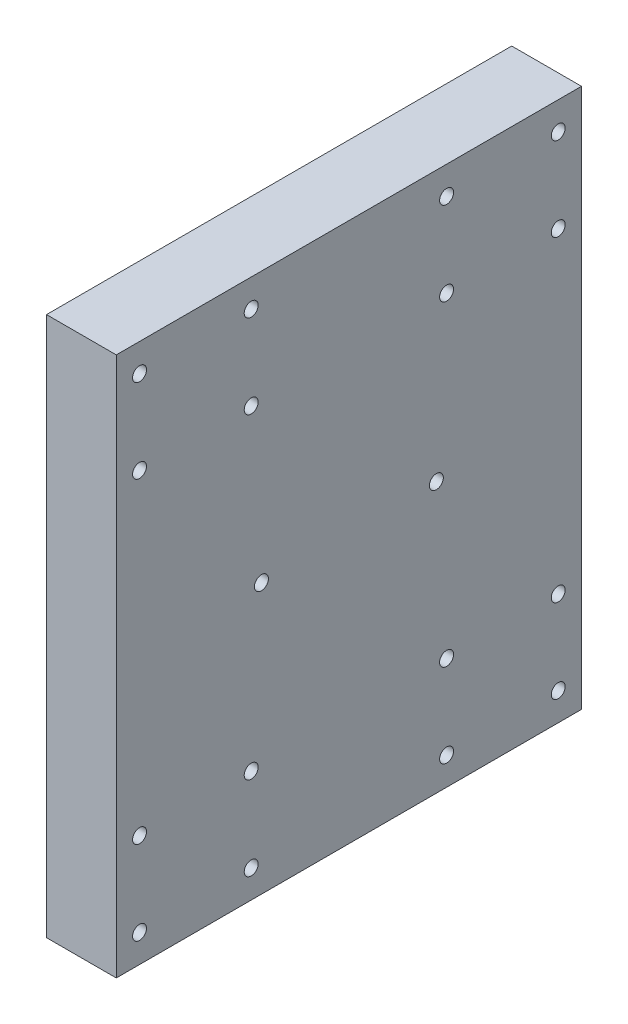
ISO-10303-21;
HEADER;
FILE_DESCRIPTION(('STEP AP214'),'2;1');
FILE_NAME('part.step','',(''),(''),'','','');
FILE_SCHEMA(('AUTOMOTIVE_DESIGN { 1 0 10303 214 1 1 1 1 }'));
ENDSEC;
DATA;
#1=APPLICATION_CONTEXT('core data for automotive mechanical design processes');
#2=APPLICATION_PROTOCOL_DEFINITION('international standard','automotive_design',2000,#1);
#3=PRODUCT_CONTEXT('',#1,'mechanical');
#4=PRODUCT('Part','Part','',(#3));
#5=PRODUCT_RELATED_PRODUCT_CATEGORY('part','',(#4));
#6=PRODUCT_DEFINITION_FORMATION('','',#4);
#7=PRODUCT_DEFINITION_CONTEXT('part definition',#1,'design');
#8=PRODUCT_DEFINITION('design','',#6,#7);
#9=PRODUCT_DEFINITION_SHAPE('','',#8);
#10=(LENGTH_UNIT() NAMED_UNIT(*) SI_UNIT(.MILLI.,.METRE.));
#11=(NAMED_UNIT(*) PLANE_ANGLE_UNIT() SI_UNIT($,.RADIAN.));
#12=(NAMED_UNIT(*) SI_UNIT($,.STERADIAN.) SOLID_ANGLE_UNIT());
#13=UNCERTAINTY_MEASURE_WITH_UNIT(LENGTH_MEASURE(1.E-05),#10,'distance_accuracy_value','');
#14=(GEOMETRIC_REPRESENTATION_CONTEXT(3) GLOBAL_UNCERTAINTY_ASSIGNED_CONTEXT((#13)) GLOBAL_UNIT_ASSIGNED_CONTEXT((#10,
#11,#12)) REPRESENTATION_CONTEXT('',''));
#15=CARTESIAN_POINT('',(0.,0.,0.));
#16=DIRECTION('',(0.,0.,1.));
#17=DIRECTION('',(1.,0.,0.));
#18=AXIS2_PLACEMENT_3D('',#15,#16,#17);
#19=CARTESIAN_POINT('',(15.,0.,0.));
#20=DIRECTION('',(-1.,0.,0.));
#21=DIRECTION('',(0.,0.,1.));
#22=AXIS2_PLACEMENT_3D('',#19,#20,#21);
#23=PLANE('',#22);
#24=CARTESIAN_POINT('',(15.,110.,-71.));
#25=DIRECTION('',(1.,0.,0.));
#26=DIRECTION('',(0.,0.,1.));
#27=AXIS2_PLACEMENT_3D('',#24,#25,#26);
#28=CIRCLE('',#27,1.5);
#29=CARTESIAN_POINT('',(15.,110.,-69.5));
#30=VERTEX_POINT('',#29);
#31=EDGE_CURVE('E205',#30,#30,#28,.T.);
#32=ORIENTED_EDGE('',*,*,#31,.F.);
#33=EDGE_LOOP('',(#32));
#34=FACE_BOUND('',#33,.T.);
#35=CARTESIAN_POINT('',(15.,92.,-95.));
#36=DIRECTION('',(1.,0.,0.));
#37=DIRECTION('',(0.,0.,1.));
#38=AXIS2_PLACEMENT_3D('',#35,#36,#37);
#39=CIRCLE('',#38,1.5);
#40=CARTESIAN_POINT('',(15.,92.,-93.5));
#41=VERTEX_POINT('',#40);
#42=EDGE_CURVE('E193',#41,#41,#39,.T.);
#43=ORIENTED_EDGE('',*,*,#42,.F.);
#44=EDGE_LOOP('',(#43));
#45=FACE_BOUND('',#44,.T.);
#46=CARTESIAN_POINT('',(15.,24.,-95.));
#47=DIRECTION('',(1.,0.,0.));
#48=DIRECTION('',(0.,0.,-1.));
#49=AXIS2_PLACEMENT_3D('',#46,#47,#48);
#50=CIRCLE('',#49,1.5);
#51=CARTESIAN_POINT('',(15.,24.,-96.5));
#52=VERTEX_POINT('',#51);
#53=EDGE_CURVE('E181',#52,#52,#50,.T.);
#54=ORIENTED_EDGE('',*,*,#53,.F.);
#55=EDGE_LOOP('',(#54));
#56=FACE_BOUND('',#55,.T.);
#57=CARTESIAN_POINT('',(15.,6.00000000000002,-71.));
#58=DIRECTION('',(1.,0.,0.));
#59=DIRECTION('',(0.,0.,-1.));
#60=AXIS2_PLACEMENT_3D('',#57,#58,#59);
#61=CIRCLE('',#60,1.5);
#62=CARTESIAN_POINT('',(15.,6.00000000000002,-72.5));
#63=VERTEX_POINT('',#62);
#64=EDGE_CURVE('E169',#63,#63,#61,.T.);
#65=ORIENTED_EDGE('',*,*,#64,.F.);
#66=EDGE_LOOP('',(#65));
#67=FACE_BOUND('',#66,.T.);
#68=CARTESIAN_POINT('',(15.,58.,-31.2));
#69=DIRECTION('',(1.,0.,0.));
#70=DIRECTION('',(0.,0.,-1.));
#71=AXIS2_PLACEMENT_3D('',#68,#69,#70);
#72=CIRCLE('',#71,1.5);
#73=CARTESIAN_POINT('',(15.,58.,-32.7));
#74=VERTEX_POINT('',#73);
#75=EDGE_CURVE('E157',#74,#74,#72,.T.);
#76=ORIENTED_EDGE('',*,*,#75,.F.);
#77=EDGE_LOOP('',(#76));
#78=FACE_BOUND('',#77,.T.);
#79=CARTESIAN_POINT('',(15.,6.00000000000001,-29.));
#80=DIRECTION('',(1.,0.,0.));
#81=DIRECTION('',(0.,0.,1.));
#82=AXIS2_PLACEMENT_3D('',#79,#80,#81);
#83=CIRCLE('',#82,1.5);
#84=CARTESIAN_POINT('',(15.,6.00000000000001,-27.5));
#85=VERTEX_POINT('',#84);
#86=EDGE_CURVE('E145',#85,#85,#83,.T.);
#87=ORIENTED_EDGE('',*,*,#86,.F.);
#88=EDGE_LOOP('',(#87));
#89=FACE_BOUND('',#88,.T.);
#90=CARTESIAN_POINT('',(15.,24.,-5.));
#91=DIRECTION('',(1.,0.,0.));
#92=DIRECTION('',(0.,0.,1.));
#93=AXIS2_PLACEMENT_3D('',#90,#91,#92);
#94=CIRCLE('',#93,1.5);
#95=CARTESIAN_POINT('',(15.,24.,-3.5));
#96=VERTEX_POINT('',#95);
#97=EDGE_CURVE('E133',#96,#96,#94,.T.);
#98=ORIENTED_EDGE('',*,*,#97,.F.);
#99=EDGE_LOOP('',(#98));
#100=FACE_BOUND('',#99,.T.);
#101=CARTESIAN_POINT('',(15.,92.,-5.));
#102=DIRECTION('',(1.,0.,0.));
#103=DIRECTION('',(0.,0.,-1.));
#104=AXIS2_PLACEMENT_3D('',#101,#102,#103);
#105=CIRCLE('',#104,1.5);
#106=CARTESIAN_POINT('',(15.,92.,-6.5));
#107=VERTEX_POINT('',#106);
#108=EDGE_CURVE('E121',#107,#107,#105,.T.);
#109=ORIENTED_EDGE('',*,*,#108,.F.);
#110=EDGE_LOOP('',(#109));
#111=FACE_BOUND('',#110,.T.);
#112=CARTESIAN_POINT('',(15.,110.,-5.));
#113=DIRECTION('',(1.,0.,0.));
#114=DIRECTION('',(0.,0.,-1.));
#115=AXIS2_PLACEMENT_3D('',#112,#113,#114);
#116=CIRCLE('',#115,1.5);
#117=CARTESIAN_POINT('',(15.,110.,-6.5));
#118=VERTEX_POINT('',#117);
#119=EDGE_CURVE('E100',#118,#118,#116,.T.);
#120=ORIENTED_EDGE('',*,*,#119,.F.);
#121=EDGE_LOOP('',(#120));
#122=FACE_BOUND('',#121,.T.);
#123=DIRECTION('',(0.,-1.,0.));
#124=VECTOR('',#123,1.);
#125=CARTESIAN_POINT('',(15.,0.,0.));
#126=LINE('',#125,#124);
#127=CARTESIAN_POINT('',(15.,116.,0.));
#128=VERTEX_POINT('',#127);
#129=CARTESIAN_POINT('',(15.,0.,0.));
#130=VERTEX_POINT('',#129);
#131=EDGE_CURVE('E85',#128,#130,#126,.T.);
#132=ORIENTED_EDGE('',*,*,#131,.T.);
#133=DIRECTION('',(0.,0.,-1.));
#134=VECTOR('',#133,1.);
#135=CARTESIAN_POINT('',(15.,0.,0.));
#136=LINE('',#135,#134);
#137=CARTESIAN_POINT('',(15.,0.,-100.));
#138=VERTEX_POINT('',#137);
#139=EDGE_CURVE('E80',#130,#138,#136,.T.);
#140=ORIENTED_EDGE('',*,*,#139,.T.);
#141=DIRECTION('',(0.,1.,0.));
#142=VECTOR('',#141,1.);
#143=CARTESIAN_POINT('',(15.,0.,-100.));
#144=LINE('',#143,#142);
#145=CARTESIAN_POINT('',(15.,116.,-100.));
#146=VERTEX_POINT('',#145);
#147=EDGE_CURVE('E83',#138,#146,#144,.T.);
#148=ORIENTED_EDGE('',*,*,#147,.T.);
#149=DIRECTION('',(0.,0.,1.));
#150=VECTOR('',#149,1.);
#151=CARTESIAN_POINT('',(15.,116.,0.));
#152=LINE('',#151,#150);
#153=EDGE_CURVE('E50',#146,#128,#152,.T.);
#154=ORIENTED_EDGE('',*,*,#153,.T.);
#155=EDGE_LOOP('',(#132,#140,#148,#154));
#156=FACE_BOUND('',#155,.T.);
#157=CARTESIAN_POINT('',(15.,110.,-29.));
#158=DIRECTION('',(1.,0.,0.));
#159=DIRECTION('',(0.,0.,-1.));
#160=AXIS2_PLACEMENT_3D('',#157,#158,#159);
#161=CIRCLE('',#160,1.5);
#162=CARTESIAN_POINT('',(15.,110.,-30.5));
#163=VERTEX_POINT('',#162);
#164=EDGE_CURVE('E115',#163,#163,#161,.T.);
#165=ORIENTED_EDGE('',*,*,#164,.F.);
#166=EDGE_LOOP('',(#165));
#167=FACE_BOUND('',#166,.T.);
#168=CARTESIAN_POINT('',(15.,92.,-29.));
#169=DIRECTION('',(1.,0.,0.));
#170=DIRECTION('',(0.,0.,-1.));
#171=AXIS2_PLACEMENT_3D('',#168,#169,#170);
#172=CIRCLE('',#171,1.5);
#173=CARTESIAN_POINT('',(15.,92.,-30.5));
#174=VERTEX_POINT('',#173);
#175=EDGE_CURVE('E127',#174,#174,#172,.T.);
#176=ORIENTED_EDGE('',*,*,#175,.F.);
#177=EDGE_LOOP('',(#176));
#178=FACE_BOUND('',#177,.T.);
#179=CARTESIAN_POINT('',(15.,24.,-29.));
#180=DIRECTION('',(1.,0.,0.));
#181=DIRECTION('',(0.,0.,1.));
#182=AXIS2_PLACEMENT_3D('',#179,#180,#181);
#183=CIRCLE('',#182,1.5);
#184=CARTESIAN_POINT('',(15.,24.,-27.5));
#185=VERTEX_POINT('',#184);
#186=EDGE_CURVE('E139',#185,#185,#183,.T.);
#187=ORIENTED_EDGE('',*,*,#186,.F.);
#188=EDGE_LOOP('',(#187));
#189=FACE_BOUND('',#188,.T.);
#190=CARTESIAN_POINT('',(15.,6.00000000000001,-5.));
#191=DIRECTION('',(1.,0.,0.));
#192=DIRECTION('',(0.,0.,1.));
#193=AXIS2_PLACEMENT_3D('',#190,#191,#192);
#194=CIRCLE('',#193,1.5);
#195=CARTESIAN_POINT('',(15.,6.00000000000001,-3.5));
#196=VERTEX_POINT('',#195);
#197=EDGE_CURVE('E151',#196,#196,#194,.T.);
#198=ORIENTED_EDGE('',*,*,#197,.F.);
#199=EDGE_LOOP('',(#198));
#200=FACE_BOUND('',#199,.T.);
#201=CARTESIAN_POINT('',(15.,58.,-68.8));
#202=DIRECTION('',(1.,0.,0.));
#203=DIRECTION('',(0.,0.,-1.));
#204=AXIS2_PLACEMENT_3D('',#201,#202,#203);
#205=CIRCLE('',#204,1.5);
#206=CARTESIAN_POINT('',(15.,58.,-70.3));
#207=VERTEX_POINT('',#206);
#208=EDGE_CURVE('E163',#207,#207,#205,.T.);
#209=ORIENTED_EDGE('',*,*,#208,.F.);
#210=EDGE_LOOP('',(#209));
#211=FACE_BOUND('',#210,.T.);
#212=CARTESIAN_POINT('',(15.,6.00000000000001,-95.));
#213=DIRECTION('',(1.,0.,0.));
#214=DIRECTION('',(0.,0.,-1.));
#215=AXIS2_PLACEMENT_3D('',#212,#213,#214);
#216=CIRCLE('',#215,1.5);
#217=CARTESIAN_POINT('',(15.,6.00000000000001,-96.5));
#218=VERTEX_POINT('',#217);
#219=EDGE_CURVE('E175',#218,#218,#216,.T.);
#220=ORIENTED_EDGE('',*,*,#219,.F.);
#221=EDGE_LOOP('',(#220));
#222=FACE_BOUND('',#221,.T.);
#223=CARTESIAN_POINT('',(15.,24.,-71.));
#224=DIRECTION('',(1.,0.,0.));
#225=DIRECTION('',(0.,0.,-1.));
#226=AXIS2_PLACEMENT_3D('',#223,#224,#225);
#227=CIRCLE('',#226,1.5);
#228=CARTESIAN_POINT('',(15.,24.,-72.5));
#229=VERTEX_POINT('',#228);
#230=EDGE_CURVE('E187',#229,#229,#227,.T.);
#231=ORIENTED_EDGE('',*,*,#230,.F.);
#232=EDGE_LOOP('',(#231));
#233=FACE_BOUND('',#232,.T.);
#234=CARTESIAN_POINT('',(15.,92.,-71.));
#235=DIRECTION('',(1.,0.,0.));
#236=DIRECTION('',(0.,0.,1.));
#237=AXIS2_PLACEMENT_3D('',#234,#235,#236);
#238=CIRCLE('',#237,1.5);
#239=CARTESIAN_POINT('',(15.,92.,-69.5));
#240=VERTEX_POINT('',#239);
#241=EDGE_CURVE('E199',#240,#240,#238,.T.);
#242=ORIENTED_EDGE('',*,*,#241,.F.);
#243=EDGE_LOOP('',(#242));
#244=FACE_BOUND('',#243,.T.);
#245=CARTESIAN_POINT('',(15.,110.,-95.));
#246=DIRECTION('',(1.,0.,0.));
#247=DIRECTION('',(0.,0.,1.));
#248=AXIS2_PLACEMENT_3D('',#245,#246,#247);
#249=CIRCLE('',#248,1.5);
#250=CARTESIAN_POINT('',(15.,110.,-93.5));
#251=VERTEX_POINT('',#250);
#252=EDGE_CURVE('E211',#251,#251,#249,.T.);
#253=ORIENTED_EDGE('',*,*,#252,.F.);
#254=EDGE_LOOP('',(#253));
#255=FACE_BOUND('',#254,.T.);
#256=ADVANCED_FACE('F33',(#34,#45,#56,#67,#78,#89,#100,#111,#122,#156,#167,#178,#189,#200,#211,
#222,#233,#244,#255),#23,.F.);
#257=CARTESIAN_POINT('',(0.,0.,0.));
#258=DIRECTION('',(-1.,0.,0.));
#259=DIRECTION('',(0.,0.,1.));
#260=AXIS2_PLACEMENT_3D('',#257,#258,#259);
#261=PLANE('',#260);
#262=CARTESIAN_POINT('',(0.,17.,-46.5));
#263=DIRECTION('',(-1.,0.,0.));
#264=DIRECTION('',(0.,0.,1.));
#265=AXIS2_PLACEMENT_3D('',#262,#263,#264);
#266=CIRCLE('',#265,11.);
#267=CARTESIAN_POINT('',(0.,17.,-35.5));
#268=VERTEX_POINT('',#267);
#269=EDGE_CURVE('E226',#268,#268,#266,.T.);
#270=ORIENTED_EDGE('',*,*,#269,.F.);
#271=EDGE_LOOP('',(#270));
#272=FACE_BOUND('',#271,.T.);
#273=CARTESIAN_POINT('',(0.,99.,-46.5));
#274=DIRECTION('',(-1.,0.,0.));
#275=DIRECTION('',(0.,0.,1.));
#276=AXIS2_PLACEMENT_3D('',#273,#274,#275);
#277=CIRCLE('',#276,11.);
#278=CARTESIAN_POINT('',(0.,99.,-35.5));
#279=VERTEX_POINT('',#278);
#280=EDGE_CURVE('E220',#279,#279,#277,.T.);
#281=ORIENTED_EDGE('',*,*,#280,.F.);
#282=EDGE_LOOP('',(#281));
#283=FACE_BOUND('',#282,.T.);
#284=CARTESIAN_POINT('',(0.,110.,-71.));
#285=DIRECTION('',(1.,0.,0.));
#286=DIRECTION('',(0.,0.,1.));
#287=AXIS2_PLACEMENT_3D('',#284,#285,#286);
#288=CIRCLE('',#287,1.5);
#289=CARTESIAN_POINT('',(0.,110.,-69.5));
#290=VERTEX_POINT('',#289);
#291=EDGE_CURVE('E208',#290,#290,#288,.T.);
#292=ORIENTED_EDGE('',*,*,#291,.T.);
#293=EDGE_LOOP('',(#292));
#294=FACE_BOUND('',#293,.T.);
#295=CARTESIAN_POINT('',(0.,92.,-95.));
#296=DIRECTION('',(1.,0.,0.));
#297=DIRECTION('',(0.,0.,1.));
#298=AXIS2_PLACEMENT_3D('',#295,#296,#297);
#299=CIRCLE('',#298,1.5);
#300=CARTESIAN_POINT('',(0.,92.,-93.5));
#301=VERTEX_POINT('',#300);
#302=EDGE_CURVE('E196',#301,#301,#299,.T.);
#303=ORIENTED_EDGE('',*,*,#302,.T.);
#304=EDGE_LOOP('',(#303));
#305=FACE_BOUND('',#304,.T.);
#306=CARTESIAN_POINT('',(0.,24.,-95.));
#307=DIRECTION('',(1.,0.,0.));
#308=DIRECTION('',(0.,0.,-1.));
#309=AXIS2_PLACEMENT_3D('',#306,#307,#308);
#310=CIRCLE('',#309,1.5);
#311=CARTESIAN_POINT('',(0.,24.,-96.5));
#312=VERTEX_POINT('',#311);
#313=EDGE_CURVE('E184',#312,#312,#310,.T.);
#314=ORIENTED_EDGE('',*,*,#313,.T.);
#315=EDGE_LOOP('',(#314));
#316=FACE_BOUND('',#315,.T.);
#317=CARTESIAN_POINT('',(0.,6.00000000000002,-71.));
#318=DIRECTION('',(1.,0.,0.));
#319=DIRECTION('',(0.,0.,-1.));
#320=AXIS2_PLACEMENT_3D('',#317,#318,#319);
#321=CIRCLE('',#320,1.5);
#322=CARTESIAN_POINT('',(0.,6.00000000000002,-72.5));
#323=VERTEX_POINT('',#322);
#324=EDGE_CURVE('E172',#323,#323,#321,.T.);
#325=ORIENTED_EDGE('',*,*,#324,.T.);
#326=EDGE_LOOP('',(#325));
#327=FACE_BOUND('',#326,.T.);
#328=CARTESIAN_POINT('',(0.,58.,-31.2));
#329=DIRECTION('',(1.,0.,0.));
#330=DIRECTION('',(0.,0.,-1.));
#331=AXIS2_PLACEMENT_3D('',#328,#329,#330);
#332=CIRCLE('',#331,1.5);
#333=CARTESIAN_POINT('',(0.,58.,-32.7));
#334=VERTEX_POINT('',#333);
#335=EDGE_CURVE('E160',#334,#334,#332,.T.);
#336=ORIENTED_EDGE('',*,*,#335,.T.);
#337=EDGE_LOOP('',(#336));
#338=FACE_BOUND('',#337,.T.);
#339=CARTESIAN_POINT('',(0.,6.00000000000001,-29.));
#340=DIRECTION('',(1.,0.,0.));
#341=DIRECTION('',(0.,0.,1.));
#342=AXIS2_PLACEMENT_3D('',#339,#340,#341);
#343=CIRCLE('',#342,1.5);
#344=CARTESIAN_POINT('',(0.,6.00000000000001,-27.5));
#345=VERTEX_POINT('',#344);
#346=EDGE_CURVE('E148',#345,#345,#343,.T.);
#347=ORIENTED_EDGE('',*,*,#346,.T.);
#348=EDGE_LOOP('',(#347));
#349=FACE_BOUND('',#348,.T.);
#350=CARTESIAN_POINT('',(0.,24.,-5.));
#351=DIRECTION('',(1.,0.,0.));
#352=DIRECTION('',(0.,0.,1.));
#353=AXIS2_PLACEMENT_3D('',#350,#351,#352);
#354=CIRCLE('',#353,1.5);
#355=CARTESIAN_POINT('',(0.,24.,-3.5));
#356=VERTEX_POINT('',#355);
#357=EDGE_CURVE('E136',#356,#356,#354,.T.);
#358=ORIENTED_EDGE('',*,*,#357,.T.);
#359=EDGE_LOOP('',(#358));
#360=FACE_BOUND('',#359,.T.);
#361=CARTESIAN_POINT('',(0.,92.,-5.));
#362=DIRECTION('',(1.,0.,0.));
#363=DIRECTION('',(0.,0.,-1.));
#364=AXIS2_PLACEMENT_3D('',#361,#362,#363);
#365=CIRCLE('',#364,1.5);
#366=CARTESIAN_POINT('',(0.,92.,-6.5));
#367=VERTEX_POINT('',#366);
#368=EDGE_CURVE('E124',#367,#367,#365,.T.);
#369=ORIENTED_EDGE('',*,*,#368,.T.);
#370=EDGE_LOOP('',(#369));
#371=FACE_BOUND('',#370,.T.);
#372=CARTESIAN_POINT('',(0.,110.,-5.));
#373=DIRECTION('',(1.,0.,0.));
#374=DIRECTION('',(0.,0.,-1.));
#375=AXIS2_PLACEMENT_3D('',#372,#373,#374);
#376=CIRCLE('',#375,1.5);
#377=CARTESIAN_POINT('',(0.,110.,-6.5));
#378=VERTEX_POINT('',#377);
#379=EDGE_CURVE('E112',#378,#378,#376,.T.);
#380=ORIENTED_EDGE('',*,*,#379,.T.);
#381=EDGE_LOOP('',(#380));
#382=FACE_BOUND('',#381,.T.);
#383=DIRECTION('',(0.,-1.,0.));
#384=VECTOR('',#383,1.);
#385=CARTESIAN_POINT('',(0.,0.,0.));
#386=LINE('',#385,#384);
#387=CARTESIAN_POINT('',(0.,116.,0.));
#388=VERTEX_POINT('',#387);
#389=CARTESIAN_POINT('',(0.,0.,0.));
#390=VERTEX_POINT('',#389);
#391=EDGE_CURVE('E97',#388,#390,#386,.T.);
#392=ORIENTED_EDGE('',*,*,#391,.F.);
#393=DIRECTION('',(0.,0.,1.));
#394=VECTOR('',#393,1.);
#395=CARTESIAN_POINT('',(0.,116.,0.));
#396=LINE('',#395,#394);
#397=CARTESIAN_POINT('',(0.,116.,-100.));
#398=VERTEX_POINT('',#397);
#399=EDGE_CURVE('E73',#398,#388,#396,.T.);
#400=ORIENTED_EDGE('',*,*,#399,.F.);
#401=DIRECTION('',(0.,1.,0.));
#402=VECTOR('',#401,1.);
#403=CARTESIAN_POINT('',(0.,0.,-100.));
#404=LINE('',#403,#402);
#405=CARTESIAN_POINT('',(0.,0.,-100.));
#406=VERTEX_POINT('',#405);
#407=EDGE_CURVE('E67',#406,#398,#404,.T.);
#408=ORIENTED_EDGE('',*,*,#407,.F.);
#409=DIRECTION('',(0.,0.,-1.));
#410=VECTOR('',#409,1.);
#411=CARTESIAN_POINT('',(0.,0.,0.));
#412=LINE('',#411,#410);
#413=EDGE_CURVE('E89',#390,#406,#412,.T.);
#414=ORIENTED_EDGE('',*,*,#413,.F.);
#415=EDGE_LOOP('',(#392,#400,#408,#414));
#416=FACE_BOUND('',#415,.T.);
#417=CARTESIAN_POINT('',(0.,110.,-29.));
#418=DIRECTION('',(1.,0.,0.));
#419=DIRECTION('',(0.,0.,-1.));
#420=AXIS2_PLACEMENT_3D('',#417,#418,#419);
#421=CIRCLE('',#420,1.5);
#422=CARTESIAN_POINT('',(0.,110.,-30.5));
#423=VERTEX_POINT('',#422);
#424=EDGE_CURVE('E118',#423,#423,#421,.T.);
#425=ORIENTED_EDGE('',*,*,#424,.T.);
#426=EDGE_LOOP('',(#425));
#427=FACE_BOUND('',#426,.T.);
#428=CARTESIAN_POINT('',(0.,92.,-29.));
#429=DIRECTION('',(1.,0.,0.));
#430=DIRECTION('',(0.,0.,-1.));
#431=AXIS2_PLACEMENT_3D('',#428,#429,#430);
#432=CIRCLE('',#431,1.5);
#433=CARTESIAN_POINT('',(0.,92.,-30.5));
#434=VERTEX_POINT('',#433);
#435=EDGE_CURVE('E130',#434,#434,#432,.T.);
#436=ORIENTED_EDGE('',*,*,#435,.T.);
#437=EDGE_LOOP('',(#436));
#438=FACE_BOUND('',#437,.T.);
#439=CARTESIAN_POINT('',(0.,24.,-29.));
#440=DIRECTION('',(1.,0.,0.));
#441=DIRECTION('',(0.,0.,1.));
#442=AXIS2_PLACEMENT_3D('',#439,#440,#441);
#443=CIRCLE('',#442,1.5);
#444=CARTESIAN_POINT('',(0.,24.,-27.5));
#445=VERTEX_POINT('',#444);
#446=EDGE_CURVE('E142',#445,#445,#443,.T.);
#447=ORIENTED_EDGE('',*,*,#446,.T.);
#448=EDGE_LOOP('',(#447));
#449=FACE_BOUND('',#448,.T.);
#450=CARTESIAN_POINT('',(0.,6.00000000000001,-5.));
#451=DIRECTION('',(1.,0.,0.));
#452=DIRECTION('',(0.,0.,1.));
#453=AXIS2_PLACEMENT_3D('',#450,#451,#452);
#454=CIRCLE('',#453,1.5);
#455=CARTESIAN_POINT('',(0.,6.00000000000001,-3.5));
#456=VERTEX_POINT('',#455);
#457=EDGE_CURVE('E154',#456,#456,#454,.T.);
#458=ORIENTED_EDGE('',*,*,#457,.T.);
#459=EDGE_LOOP('',(#458));
#460=FACE_BOUND('',#459,.T.);
#461=CARTESIAN_POINT('',(0.,58.,-68.8));
#462=DIRECTION('',(1.,0.,0.));
#463=DIRECTION('',(0.,0.,-1.));
#464=AXIS2_PLACEMENT_3D('',#461,#462,#463);
#465=CIRCLE('',#464,1.5);
#466=CARTESIAN_POINT('',(0.,58.,-70.3));
#467=VERTEX_POINT('',#466);
#468=EDGE_CURVE('E166',#467,#467,#465,.T.);
#469=ORIENTED_EDGE('',*,*,#468,.T.);
#470=EDGE_LOOP('',(#469));
#471=FACE_BOUND('',#470,.T.);
#472=CARTESIAN_POINT('',(0.,6.00000000000001,-95.));
#473=DIRECTION('',(1.,0.,0.));
#474=DIRECTION('',(0.,0.,-1.));
#475=AXIS2_PLACEMENT_3D('',#472,#473,#474);
#476=CIRCLE('',#475,1.5);
#477=CARTESIAN_POINT('',(0.,6.00000000000001,-96.5));
#478=VERTEX_POINT('',#477);
#479=EDGE_CURVE('E178',#478,#478,#476,.T.);
#480=ORIENTED_EDGE('',*,*,#479,.T.);
#481=EDGE_LOOP('',(#480));
#482=FACE_BOUND('',#481,.T.);
#483=CARTESIAN_POINT('',(0.,24.,-71.));
#484=DIRECTION('',(1.,0.,0.));
#485=DIRECTION('',(0.,0.,-1.));
#486=AXIS2_PLACEMENT_3D('',#483,#484,#485);
#487=CIRCLE('',#486,1.5);
#488=CARTESIAN_POINT('',(0.,24.,-72.5));
#489=VERTEX_POINT('',#488);
#490=EDGE_CURVE('E190',#489,#489,#487,.T.);
#491=ORIENTED_EDGE('',*,*,#490,.T.);
#492=EDGE_LOOP('',(#491));
#493=FACE_BOUND('',#492,.T.);
#494=CARTESIAN_POINT('',(0.,92.,-71.));
#495=DIRECTION('',(1.,0.,0.));
#496=DIRECTION('',(0.,0.,1.));
#497=AXIS2_PLACEMENT_3D('',#494,#495,#496);
#498=CIRCLE('',#497,1.5);
#499=CARTESIAN_POINT('',(0.,92.,-69.5));
#500=VERTEX_POINT('',#499);
#501=EDGE_CURVE('E202',#500,#500,#498,.T.);
#502=ORIENTED_EDGE('',*,*,#501,.T.);
#503=EDGE_LOOP('',(#502));
#504=FACE_BOUND('',#503,.T.);
#505=CARTESIAN_POINT('',(0.,110.,-95.));
#506=DIRECTION('',(1.,0.,0.));
#507=DIRECTION('',(0.,0.,1.));
#508=AXIS2_PLACEMENT_3D('',#505,#506,#507);
#509=CIRCLE('',#508,1.5);
#510=CARTESIAN_POINT('',(0.,110.,-93.5));
#511=VERTEX_POINT('',#510);
#512=EDGE_CURVE('E214',#511,#511,#509,.T.);
#513=ORIENTED_EDGE('',*,*,#512,.T.);
#514=EDGE_LOOP('',(#513));
#515=FACE_BOUND('',#514,.T.);
#516=ADVANCED_FACE('F108',(#272,#283,#294,#305,#316,#327,#338,#349,#360,#371,#382,#416,#427,
#438,#449,#460,#471,#482,#493,#504,#515),#261,.T.);
#517=CARTESIAN_POINT('',(15.,0.,0.));
#518=DIRECTION('',(0.,0.,-1.));
#519=DIRECTION('',(-1.,0.,0.));
#520=AXIS2_PLACEMENT_3D('',#517,#518,#519);
#521=PLANE('',#520);
#522=ORIENTED_EDGE('',*,*,#391,.T.);
#523=DIRECTION('',(-1.,0.,0.));
#524=VECTOR('',#523,1.);
#525=CARTESIAN_POINT('',(15.,0.,0.));
#526=LINE('',#525,#524);
#527=EDGE_CURVE('E11',#130,#390,#526,.T.);
#528=ORIENTED_EDGE('',*,*,#527,.F.);
#529=ORIENTED_EDGE('',*,*,#131,.F.);
#530=DIRECTION('',(-1.,0.,0.));
#531=VECTOR('',#530,1.);
#532=CARTESIAN_POINT('',(15.,116.,0.));
#533=LINE('',#532,#531);
#534=EDGE_CURVE('E93',#128,#388,#533,.T.);
#535=ORIENTED_EDGE('',*,*,#534,.T.);
#536=EDGE_LOOP('',(#522,#528,#529,#535));
#537=FACE_BOUND('',#536,.T.);
#538=ADVANCED_FACE('F35',(#537),#521,.F.);
#539=CARTESIAN_POINT('',(15.,0.,0.));
#540=DIRECTION('',(0.,1.,0.));
#541=DIRECTION('',(0.,0.,1.));
#542=AXIS2_PLACEMENT_3D('',#539,#540,#541);
#543=PLANE('',#542);
#544=ORIENTED_EDGE('',*,*,#413,.T.);
#545=DIRECTION('',(-1.,0.,0.));
#546=VECTOR('',#545,1.);
#547=CARTESIAN_POINT('',(15.,0.,-100.));
#548=LINE('',#547,#546);
#549=EDGE_CURVE('E42',#138,#406,#548,.T.);
#550=ORIENTED_EDGE('',*,*,#549,.F.);
#551=ORIENTED_EDGE('',*,*,#139,.F.);
#552=ORIENTED_EDGE('',*,*,#527,.T.);
#553=EDGE_LOOP('',(#544,#550,#551,#552));
#554=FACE_BOUND('',#553,.T.);
#555=ADVANCED_FACE('F88',(#554),#543,.F.);
#556=CARTESIAN_POINT('',(15.,0.,-100.));
#557=DIRECTION('',(0.,0.,1.));
#558=DIRECTION('',(1.,0.,0.));
#559=AXIS2_PLACEMENT_3D('',#556,#557,#558);
#560=PLANE('',#559);
#561=ORIENTED_EDGE('',*,*,#407,.T.);
#562=DIRECTION('',(-1.,0.,0.));
#563=VECTOR('',#562,1.);
#564=CARTESIAN_POINT('',(15.,116.,-100.));
#565=LINE('',#564,#563);
#566=EDGE_CURVE('E90',#146,#398,#565,.T.);
#567=ORIENTED_EDGE('',*,*,#566,.F.);
#568=ORIENTED_EDGE('',*,*,#147,.F.);
#569=ORIENTED_EDGE('',*,*,#549,.T.);
#570=EDGE_LOOP('',(#561,#567,#568,#569));
#571=FACE_BOUND('',#570,.T.);
#572=ADVANCED_FACE('F91',(#571),#560,.F.);
#573=CARTESIAN_POINT('',(15.,116.,0.));
#574=DIRECTION('',(0.,-1.,0.));
#575=DIRECTION('',(0.,0.,-1.));
#576=AXIS2_PLACEMENT_3D('',#573,#574,#575);
#577=PLANE('',#576);
#578=ORIENTED_EDGE('',*,*,#399,.T.);
#579=ORIENTED_EDGE('',*,*,#534,.F.);
#580=ORIENTED_EDGE('',*,*,#153,.F.);
#581=ORIENTED_EDGE('',*,*,#566,.T.);
#582=EDGE_LOOP('',(#578,#579,#580,#581));
#583=FACE_BOUND('',#582,.T.);
#584=ADVANCED_FACE('F105',(#583),#577,.F.);
#585=CARTESIAN_POINT('',(15.,110.,-5.));
#586=DIRECTION('',(-1.,0.,0.));
#587=DIRECTION('',(0.,0.,1.));
#588=AXIS2_PLACEMENT_3D('',#585,#586,#587);
#589=CYLINDRICAL_SURFACE('',#588,1.5);
#590=ORIENTED_EDGE('',*,*,#119,.T.);
#591=EDGE_LOOP('',(#590));
#592=FACE_BOUND('',#591,.T.);
#593=ORIENTED_EDGE('',*,*,#379,.F.);
#594=EDGE_LOOP('',(#593));
#595=FACE_BOUND('',#594,.T.);
#596=ADVANCED_FACE('F264',(#592,#595),#589,.F.);
#597=CARTESIAN_POINT('',(15.,110.,-29.));
#598=DIRECTION('',(-1.,0.,0.));
#599=DIRECTION('',(0.,0.,1.));
#600=AXIS2_PLACEMENT_3D('',#597,#598,#599);
#601=CYLINDRICAL_SURFACE('',#600,1.5);
#602=ORIENTED_EDGE('',*,*,#164,.T.);
#603=EDGE_LOOP('',(#602));
#604=FACE_BOUND('',#603,.T.);
#605=ORIENTED_EDGE('',*,*,#424,.F.);
#606=EDGE_LOOP('',(#605));
#607=FACE_BOUND('',#606,.T.);
#608=ADVANCED_FACE('F266',(#604,#607),#601,.F.);
#609=CARTESIAN_POINT('',(15.,92.,-5.));
#610=DIRECTION('',(-1.,0.,0.));
#611=DIRECTION('',(0.,0.,1.));
#612=AXIS2_PLACEMENT_3D('',#609,#610,#611);
#613=CYLINDRICAL_SURFACE('',#612,1.5);
#614=ORIENTED_EDGE('',*,*,#108,.T.);
#615=EDGE_LOOP('',(#614));
#616=FACE_BOUND('',#615,.T.);
#617=ORIENTED_EDGE('',*,*,#368,.F.);
#618=EDGE_LOOP('',(#617));
#619=FACE_BOUND('',#618,.T.);
#620=ADVANCED_FACE('F273',(#616,#619),#613,.F.);
#621=CARTESIAN_POINT('',(15.,92.,-29.));
#622=DIRECTION('',(-1.,0.,0.));
#623=DIRECTION('',(0.,0.,1.));
#624=AXIS2_PLACEMENT_3D('',#621,#622,#623);
#625=CYLINDRICAL_SURFACE('',#624,1.5);
#626=ORIENTED_EDGE('',*,*,#175,.T.);
#627=EDGE_LOOP('',(#626));
#628=FACE_BOUND('',#627,.T.);
#629=ORIENTED_EDGE('',*,*,#435,.F.);
#630=EDGE_LOOP('',(#629));
#631=FACE_BOUND('',#630,.T.);
#632=ADVANCED_FACE('F394',(#628,#631),#625,.F.);
#633=CARTESIAN_POINT('',(15.,24.,-5.));
#634=DIRECTION('',(-1.,0.,0.));
#635=DIRECTION('',(0.,0.,1.));
#636=AXIS2_PLACEMENT_3D('',#633,#634,#635);
#637=CYLINDRICAL_SURFACE('',#636,1.5);
#638=ORIENTED_EDGE('',*,*,#97,.T.);
#639=EDGE_LOOP('',(#638));
#640=FACE_BOUND('',#639,.T.);
#641=ORIENTED_EDGE('',*,*,#357,.F.);
#642=EDGE_LOOP('',(#641));
#643=FACE_BOUND('',#642,.T.);
#644=ADVANCED_FACE('F390',(#640,#643),#637,.F.);
#645=CARTESIAN_POINT('',(15.,24.,-29.));
#646=DIRECTION('',(-1.,0.,0.));
#647=DIRECTION('',(0.,0.,1.));
#648=AXIS2_PLACEMENT_3D('',#645,#646,#647);
#649=CYLINDRICAL_SURFACE('',#648,1.5);
#650=ORIENTED_EDGE('',*,*,#186,.T.);
#651=EDGE_LOOP('',(#650));
#652=FACE_BOUND('',#651,.T.);
#653=ORIENTED_EDGE('',*,*,#446,.F.);
#654=EDGE_LOOP('',(#653));
#655=FACE_BOUND('',#654,.T.);
#656=ADVANCED_FACE('F386',(#652,#655),#649,.F.);
#657=CARTESIAN_POINT('',(15.,6.00000000000001,-29.));
#658=DIRECTION('',(-1.,0.,0.));
#659=DIRECTION('',(0.,0.,1.));
#660=AXIS2_PLACEMENT_3D('',#657,#658,#659);
#661=CYLINDRICAL_SURFACE('',#660,1.5);
#662=ORIENTED_EDGE('',*,*,#86,.T.);
#663=EDGE_LOOP('',(#662));
#664=FACE_BOUND('',#663,.T.);
#665=ORIENTED_EDGE('',*,*,#346,.F.);
#666=EDGE_LOOP('',(#665));
#667=FACE_BOUND('',#666,.T.);
#668=ADVANCED_FACE('F382',(#664,#667),#661,.F.);
#669=CARTESIAN_POINT('',(15.,6.00000000000001,-5.));
#670=DIRECTION('',(-1.,0.,0.));
#671=DIRECTION('',(0.,0.,1.));
#672=AXIS2_PLACEMENT_3D('',#669,#670,#671);
#673=CYLINDRICAL_SURFACE('',#672,1.5);
#674=ORIENTED_EDGE('',*,*,#197,.T.);
#675=EDGE_LOOP('',(#674));
#676=FACE_BOUND('',#675,.T.);
#677=ORIENTED_EDGE('',*,*,#457,.F.);
#678=EDGE_LOOP('',(#677));
#679=FACE_BOUND('',#678,.T.);
#680=ADVANCED_FACE('F378',(#676,#679),#673,.F.);
#681=CARTESIAN_POINT('',(15.,58.,-31.2));
#682=DIRECTION('',(-1.,0.,0.));
#683=DIRECTION('',(0.,0.,1.));
#684=AXIS2_PLACEMENT_3D('',#681,#682,#683);
#685=CYLINDRICAL_SURFACE('',#684,1.5);
#686=ORIENTED_EDGE('',*,*,#75,.T.);
#687=EDGE_LOOP('',(#686));
#688=FACE_BOUND('',#687,.T.);
#689=ORIENTED_EDGE('',*,*,#335,.F.);
#690=EDGE_LOOP('',(#689));
#691=FACE_BOUND('',#690,.T.);
#692=ADVANCED_FACE('F374',(#688,#691),#685,.F.);
#693=CARTESIAN_POINT('',(15.,58.,-68.8));
#694=DIRECTION('',(-1.,0.,0.));
#695=DIRECTION('',(0.,0.,1.));
#696=AXIS2_PLACEMENT_3D('',#693,#694,#695);
#697=CYLINDRICAL_SURFACE('',#696,1.5);
#698=ORIENTED_EDGE('',*,*,#208,.T.);
#699=EDGE_LOOP('',(#698));
#700=FACE_BOUND('',#699,.T.);
#701=ORIENTED_EDGE('',*,*,#468,.F.);
#702=EDGE_LOOP('',(#701));
#703=FACE_BOUND('',#702,.T.);
#704=ADVANCED_FACE('F370',(#700,#703),#697,.F.);
#705=CARTESIAN_POINT('',(15.,6.00000000000002,-71.));
#706=DIRECTION('',(-1.,0.,0.));
#707=DIRECTION('',(0.,0.,1.));
#708=AXIS2_PLACEMENT_3D('',#705,#706,#707);
#709=CYLINDRICAL_SURFACE('',#708,1.5);
#710=ORIENTED_EDGE('',*,*,#64,.T.);
#711=EDGE_LOOP('',(#710));
#712=FACE_BOUND('',#711,.T.);
#713=ORIENTED_EDGE('',*,*,#324,.F.);
#714=EDGE_LOOP('',(#713));
#715=FACE_BOUND('',#714,.T.);
#716=ADVANCED_FACE('F366',(#712,#715),#709,.F.);
#717=CARTESIAN_POINT('',(15.,6.00000000000001,-95.));
#718=DIRECTION('',(-1.,0.,0.));
#719=DIRECTION('',(0.,0.,1.));
#720=AXIS2_PLACEMENT_3D('',#717,#718,#719);
#721=CYLINDRICAL_SURFACE('',#720,1.5);
#722=ORIENTED_EDGE('',*,*,#219,.T.);
#723=EDGE_LOOP('',(#722));
#724=FACE_BOUND('',#723,.T.);
#725=ORIENTED_EDGE('',*,*,#479,.F.);
#726=EDGE_LOOP('',(#725));
#727=FACE_BOUND('',#726,.T.);
#728=ADVANCED_FACE('F362',(#724,#727),#721,.F.);
#729=CARTESIAN_POINT('',(15.,24.,-95.));
#730=DIRECTION('',(-1.,0.,0.));
#731=DIRECTION('',(0.,0.,1.));
#732=AXIS2_PLACEMENT_3D('',#729,#730,#731);
#733=CYLINDRICAL_SURFACE('',#732,1.5);
#734=ORIENTED_EDGE('',*,*,#53,.T.);
#735=EDGE_LOOP('',(#734));
#736=FACE_BOUND('',#735,.T.);
#737=ORIENTED_EDGE('',*,*,#313,.F.);
#738=EDGE_LOOP('',(#737));
#739=FACE_BOUND('',#738,.T.);
#740=ADVANCED_FACE('F358',(#736,#739),#733,.F.);
#741=CARTESIAN_POINT('',(15.,24.,-71.));
#742=DIRECTION('',(-1.,0.,0.));
#743=DIRECTION('',(0.,0.,1.));
#744=AXIS2_PLACEMENT_3D('',#741,#742,#743);
#745=CYLINDRICAL_SURFACE('',#744,1.5);
#746=ORIENTED_EDGE('',*,*,#230,.T.);
#747=EDGE_LOOP('',(#746));
#748=FACE_BOUND('',#747,.T.);
#749=ORIENTED_EDGE('',*,*,#490,.F.);
#750=EDGE_LOOP('',(#749));
#751=FACE_BOUND('',#750,.T.);
#752=ADVANCED_FACE('F354',(#748,#751),#745,.F.);
#753=CARTESIAN_POINT('',(15.,92.,-95.));
#754=DIRECTION('',(-1.,0.,0.));
#755=DIRECTION('',(0.,0.,1.));
#756=AXIS2_PLACEMENT_3D('',#753,#754,#755);
#757=CYLINDRICAL_SURFACE('',#756,1.5);
#758=ORIENTED_EDGE('',*,*,#42,.T.);
#759=EDGE_LOOP('',(#758));
#760=FACE_BOUND('',#759,.T.);
#761=ORIENTED_EDGE('',*,*,#302,.F.);
#762=EDGE_LOOP('',(#761));
#763=FACE_BOUND('',#762,.T.);
#764=ADVANCED_FACE('F350',(#760,#763),#757,.F.);
#765=CARTESIAN_POINT('',(15.,92.,-71.));
#766=DIRECTION('',(-1.,0.,0.));
#767=DIRECTION('',(0.,0.,1.));
#768=AXIS2_PLACEMENT_3D('',#765,#766,#767);
#769=CYLINDRICAL_SURFACE('',#768,1.5);
#770=ORIENTED_EDGE('',*,*,#241,.T.);
#771=EDGE_LOOP('',(#770));
#772=FACE_BOUND('',#771,.T.);
#773=ORIENTED_EDGE('',*,*,#501,.F.);
#774=EDGE_LOOP('',(#773));
#775=FACE_BOUND('',#774,.T.);
#776=ADVANCED_FACE('F346',(#772,#775),#769,.F.);
#777=CARTESIAN_POINT('',(15.,110.,-71.));
#778=DIRECTION('',(-1.,0.,0.));
#779=DIRECTION('',(0.,0.,1.));
#780=AXIS2_PLACEMENT_3D('',#777,#778,#779);
#781=CYLINDRICAL_SURFACE('',#780,1.5);
#782=ORIENTED_EDGE('',*,*,#31,.T.);
#783=EDGE_LOOP('',(#782));
#784=FACE_BOUND('',#783,.T.);
#785=ORIENTED_EDGE('',*,*,#291,.F.);
#786=EDGE_LOOP('',(#785));
#787=FACE_BOUND('',#786,.T.);
#788=ADVANCED_FACE('F342',(#784,#787),#781,.F.);
#789=CARTESIAN_POINT('',(15.,110.,-95.));
#790=DIRECTION('',(-1.,0.,0.));
#791=DIRECTION('',(0.,0.,1.));
#792=AXIS2_PLACEMENT_3D('',#789,#790,#791);
#793=CYLINDRICAL_SURFACE('',#792,1.5);
#794=ORIENTED_EDGE('',*,*,#252,.T.);
#795=EDGE_LOOP('',(#794));
#796=FACE_BOUND('',#795,.T.);
#797=ORIENTED_EDGE('',*,*,#512,.F.);
#798=EDGE_LOOP('',(#797));
#799=FACE_BOUND('',#798,.T.);
#800=ADVANCED_FACE('F303',(#796,#799),#793,.F.);
#801=CARTESIAN_POINT('',(7.,99.,-46.5));
#802=DIRECTION('',(-1.,0.,0.));
#803=DIRECTION('',(0.,0.,1.));
#804=AXIS2_PLACEMENT_3D('',#801,#802,#803);
#805=CYLINDRICAL_SURFACE('',#804,11.);
#806=CARTESIAN_POINT('',(7.,99.,-46.5));
#807=DIRECTION('',(-1.,0.,0.));
#808=DIRECTION('',(0.,0.,1.));
#809=AXIS2_PLACEMENT_3D('',#806,#807,#808);
#810=CIRCLE('',#809,11.);
#811=CARTESIAN_POINT('',(7.,99.,-35.5));
#812=VERTEX_POINT('',#811);
#813=EDGE_CURVE('E217',#812,#812,#810,.T.);
#814=ORIENTED_EDGE('',*,*,#813,.F.);
#815=EDGE_LOOP('',(#814));
#816=FACE_BOUND('',#815,.T.);
#817=ORIENTED_EDGE('',*,*,#280,.T.);
#818=EDGE_LOOP('',(#817));
#819=FACE_BOUND('',#818,.T.);
#820=ADVANCED_FACE('F308',(#816,#819),#805,.F.);
#821=CARTESIAN_POINT('',(7.,99.,-46.5));
#822=DIRECTION('',(-1.,0.,0.));
#823=DIRECTION('',(0.,0.,1.));
#824=AXIS2_PLACEMENT_3D('',#821,#822,#823);
#825=PLANE('',#824);
#826=ORIENTED_EDGE('',*,*,#813,.T.);
#827=EDGE_LOOP('',(#826));
#828=FACE_BOUND('',#827,.T.);
#829=ADVANCED_FACE('F237',(#828),#825,.T.);
#830=CARTESIAN_POINT('',(7.,17.,-46.5));
#831=DIRECTION('',(-1.,0.,0.));
#832=DIRECTION('',(0.,0.,1.));
#833=AXIS2_PLACEMENT_3D('',#830,#831,#832);
#834=CYLINDRICAL_SURFACE('',#833,11.);
#835=CARTESIAN_POINT('',(7.,17.,-46.5));
#836=DIRECTION('',(-1.,0.,0.));
#837=DIRECTION('',(0.,0.,1.));
#838=AXIS2_PLACEMENT_3D('',#835,#836,#837);
#839=CIRCLE('',#838,11.);
#840=CARTESIAN_POINT('',(7.,17.,-35.5));
#841=VERTEX_POINT('',#840);
#842=EDGE_CURVE('E223',#841,#841,#839,.T.);
#843=ORIENTED_EDGE('',*,*,#842,.F.);
#844=EDGE_LOOP('',(#843));
#845=FACE_BOUND('',#844,.T.);
#846=ORIENTED_EDGE('',*,*,#269,.T.);
#847=EDGE_LOOP('',(#846));
#848=FACE_BOUND('',#847,.T.);
#849=ADVANCED_FACE('F234',(#845,#848),#834,.F.);
#850=CARTESIAN_POINT('',(7.,17.,-46.5));
#851=DIRECTION('',(-1.,0.,0.));
#852=DIRECTION('',(0.,0.,1.));
#853=AXIS2_PLACEMENT_3D('',#850,#851,#852);
#854=PLANE('',#853);
#855=ORIENTED_EDGE('',*,*,#842,.T.);
#856=EDGE_LOOP('',(#855));
#857=FACE_BOUND('',#856,.T.);
#858=ADVANCED_FACE('F232',(#857),#854,.T.);
#859=CLOSED_SHELL('',(#256,#516,#538,#555,#572,#584,#596,#608,#620,#632,#644,#656,#668,#680,
#692,#704,#716,#728,#740,#752,#764,#776,#788,#800,#820,#829,#849,#858));
#860=MANIFOLD_SOLID_BREP('B2',#859);
#861=ADVANCED_BREP_SHAPE_REPRESENTATION('',(#18,#860),#14);
#862=SHAPE_DEFINITION_REPRESENTATION(#9,#861);
ENDSEC;
END-ISO-10303-21;
